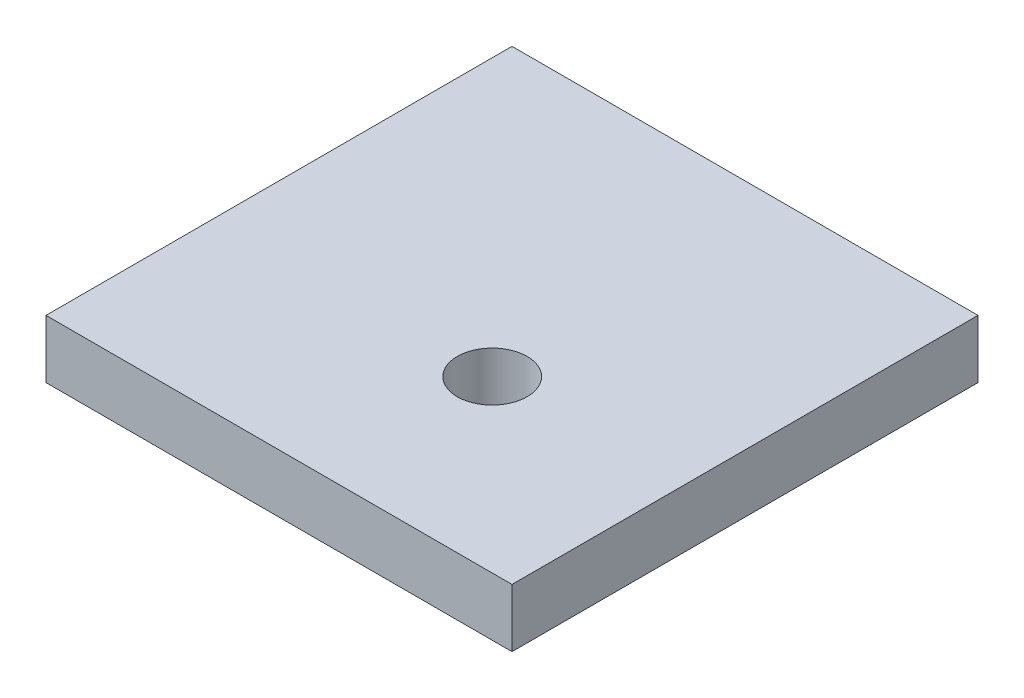
ISO-10303-21;
HEADER;
FILE_DESCRIPTION(('STEP AP214'),'2;1');
FILE_NAME('part.step','',(''),(''),'','','');
FILE_SCHEMA(('AUTOMOTIVE_DESIGN { 1 0 10303 214 1 1 1 1 }'));
ENDSEC;
DATA;
#1=APPLICATION_CONTEXT('core data for automotive mechanical design processes');
#2=APPLICATION_PROTOCOL_DEFINITION('international standard','automotive_design',2000,#1);
#3=PRODUCT_CONTEXT('',#1,'mechanical');
#4=PRODUCT('Part','Part','',(#3));
#5=PRODUCT_RELATED_PRODUCT_CATEGORY('part','',(#4));
#6=PRODUCT_DEFINITION_FORMATION('','',#4);
#7=PRODUCT_DEFINITION_CONTEXT('part definition',#1,'design');
#8=PRODUCT_DEFINITION('design','',#6,#7);
#9=PRODUCT_DEFINITION_SHAPE('','',#8);
#10=(LENGTH_UNIT() NAMED_UNIT(*) SI_UNIT(.MILLI.,.METRE.));
#11=(NAMED_UNIT(*) PLANE_ANGLE_UNIT() SI_UNIT($,.RADIAN.));
#12=(NAMED_UNIT(*) SI_UNIT($,.STERADIAN.) SOLID_ANGLE_UNIT());
#13=UNCERTAINTY_MEASURE_WITH_UNIT(LENGTH_MEASURE(1.E-05),#10,'distance_accuracy_value','');
#14=(GEOMETRIC_REPRESENTATION_CONTEXT(3) GLOBAL_UNCERTAINTY_ASSIGNED_CONTEXT((#13)) GLOBAL_UNIT_ASSIGNED_CONTEXT((#10,
#11,#12)) REPRESENTATION_CONTEXT('',''));
#15=CARTESIAN_POINT('',(0.,0.,0.));
#16=DIRECTION('',(0.,0.,1.));
#17=DIRECTION('',(1.,0.,0.));
#18=AXIS2_PLACEMENT_3D('',#15,#16,#17);
#19=CARTESIAN_POINT('',(200.,-25.,400.));
#20=DIRECTION('',(-1.,0.,0.));
#21=DIRECTION('',(0.,0.,1.));
#22=AXIS2_PLACEMENT_3D('',#19,#20,#21);
#23=PLANE('',#22);
#24=DIRECTION('',(0.,1.,0.));
#25=VECTOR('',#24,1.);
#26=CARTESIAN_POINT('',(200.,-25.,0.));
#27=LINE('',#26,#25);
#28=CARTESIAN_POINT('',(200.,-25.,0.));
#29=VERTEX_POINT('',#28);
#30=CARTESIAN_POINT('',(200.,25.,0.));
#31=VERTEX_POINT('',#30);
#32=EDGE_CURVE('E106',#29,#31,#27,.T.);
#33=ORIENTED_EDGE('',*,*,#32,.T.);
#34=DIRECTION('',(0.,0.,-1.));
#35=VECTOR('',#34,1.);
#36=CARTESIAN_POINT('',(200.,25.,400.));
#37=LINE('',#36,#35);
#38=CARTESIAN_POINT('',(200.,25.,400.));
#39=VERTEX_POINT('',#38);
#40=EDGE_CURVE('E11',#39,#31,#37,.T.);
#41=ORIENTED_EDGE('',*,*,#40,.F.);
#42=DIRECTION('',(0.,1.,0.));
#43=VECTOR('',#42,1.);
#44=CARTESIAN_POINT('',(200.,-25.,400.));
#45=LINE('',#44,#43);
#46=CARTESIAN_POINT('',(200.,-25.,400.));
#47=VERTEX_POINT('',#46);
#48=EDGE_CURVE('E90',#47,#39,#45,.T.);
#49=ORIENTED_EDGE('',*,*,#48,.F.);
#50=DIRECTION('',(0.,0.,-1.));
#51=VECTOR('',#50,1.);
#52=CARTESIAN_POINT('',(200.,-25.,400.));
#53=LINE('',#52,#51);
#54=EDGE_CURVE('E102',#47,#29,#53,.T.);
#55=ORIENTED_EDGE('',*,*,#54,.T.);
#56=EDGE_LOOP('',(#33,#41,#49,#55));
#57=FACE_BOUND('',#56,.T.);
#58=ADVANCED_FACE('F38',(#57),#23,.F.);
#59=CARTESIAN_POINT('',(-200.,25.,400.));
#60=DIRECTION('',(0.,-1.,0.));
#61=DIRECTION('',(0.,0.,-1.));
#62=AXIS2_PLACEMENT_3D('',#59,#60,#61);
#63=PLANE('',#62);
#64=CARTESIAN_POINT('',(37.,25.,254.));
#65=DIRECTION('',(0.,1.,0.));
#66=DIRECTION('',(0.,0.,1.));
#67=AXIS2_PLACEMENT_3D('',#64,#65,#66);
#68=CIRCLE('',#67,30.);
#69=CARTESIAN_POINT('',(37.,25.,284.));
#70=VERTEX_POINT('',#69);
#71=EDGE_CURVE('E127',#70,#70,#68,.T.);
#72=ORIENTED_EDGE('',*,*,#71,.F.);
#73=EDGE_LOOP('',(#72));
#74=FACE_BOUND('',#73,.T.);
#75=DIRECTION('',(-1.,0.,0.));
#76=VECTOR('',#75,1.);
#77=CARTESIAN_POINT('',(-200.,25.,0.));
#78=LINE('',#77,#76);
#79=CARTESIAN_POINT('',(-200.,25.,0.));
#80=VERTEX_POINT('',#79);
#81=EDGE_CURVE('E95',#31,#80,#78,.T.);
#82=ORIENTED_EDGE('',*,*,#81,.T.);
#83=DIRECTION('',(0.,0.,-1.));
#84=VECTOR('',#83,1.);
#85=CARTESIAN_POINT('',(-200.,25.,400.));
#86=LINE('',#85,#84);
#87=CARTESIAN_POINT('',(-200.,25.,400.));
#88=VERTEX_POINT('',#87);
#89=EDGE_CURVE('E47',#88,#80,#86,.T.);
#90=ORIENTED_EDGE('',*,*,#89,.F.);
#91=DIRECTION('',(-1.,0.,0.));
#92=VECTOR('',#91,1.);
#93=CARTESIAN_POINT('',(-200.,25.,400.));
#94=LINE('',#93,#92);
#95=EDGE_CURVE('E85',#39,#88,#94,.T.);
#96=ORIENTED_EDGE('',*,*,#95,.F.);
#97=ORIENTED_EDGE('',*,*,#40,.T.);
#98=EDGE_LOOP('',(#82,#90,#96,#97));
#99=FACE_BOUND('',#98,.T.);
#100=ADVANCED_FACE('F94',(#74,#99),#63,.F.);
#101=CARTESIAN_POINT('',(-200.,-25.,400.));
#102=DIRECTION('',(1.,0.,0.));
#103=DIRECTION('',(0.,0.,-1.));
#104=AXIS2_PLACEMENT_3D('',#101,#102,#103);
#105=PLANE('',#104);
#106=DIRECTION('',(0.,-1.,0.));
#107=VECTOR('',#106,1.);
#108=CARTESIAN_POINT('',(-200.,-25.,0.));
#109=LINE('',#108,#107);
#110=CARTESIAN_POINT('',(-200.,-25.,0.));
#111=VERTEX_POINT('',#110);
#112=EDGE_CURVE('E72',#80,#111,#109,.T.);
#113=ORIENTED_EDGE('',*,*,#112,.T.);
#114=DIRECTION('',(0.,0.,-1.));
#115=VECTOR('',#114,1.);
#116=CARTESIAN_POINT('',(-200.,-25.,400.));
#117=LINE('',#116,#115);
#118=CARTESIAN_POINT('',(-200.,-25.,400.));
#119=VERTEX_POINT('',#118);
#120=EDGE_CURVE('E97',#119,#111,#117,.T.);
#121=ORIENTED_EDGE('',*,*,#120,.F.);
#122=DIRECTION('',(0.,-1.,0.));
#123=VECTOR('',#122,1.);
#124=CARTESIAN_POINT('',(-200.,-25.,400.));
#125=LINE('',#124,#123);
#126=EDGE_CURVE('E88',#88,#119,#125,.T.);
#127=ORIENTED_EDGE('',*,*,#126,.F.);
#128=ORIENTED_EDGE('',*,*,#89,.T.);
#129=EDGE_LOOP('',(#113,#121,#127,#128));
#130=FACE_BOUND('',#129,.T.);
#131=ADVANCED_FACE('F98',(#130),#105,.F.);
#132=CARTESIAN_POINT('',(-200.,-25.,400.));
#133=DIRECTION('',(0.,1.,0.));
#134=DIRECTION('',(0.,0.,1.));
#135=AXIS2_PLACEMENT_3D('',#132,#133,#134);
#136=PLANE('',#135);
#137=CARTESIAN_POINT('',(37.,-25.,254.));
#138=DIRECTION('',(0.,1.,0.));
#139=DIRECTION('',(0.,0.,1.));
#140=AXIS2_PLACEMENT_3D('',#137,#138,#139);
#141=CIRCLE('',#140,30.);
#142=CARTESIAN_POINT('',(37.,-25.,284.));
#143=VERTEX_POINT('',#142);
#144=EDGE_CURVE('E110',#143,#143,#141,.T.);
#145=ORIENTED_EDGE('',*,*,#144,.T.);
#146=EDGE_LOOP('',(#145));
#147=FACE_BOUND('',#146,.T.);
#148=DIRECTION('',(1.,0.,0.));
#149=VECTOR('',#148,1.);
#150=CARTESIAN_POINT('',(-200.,-25.,0.));
#151=LINE('',#150,#149);
#152=EDGE_CURVE('E78',#111,#29,#151,.T.);
#153=ORIENTED_EDGE('',*,*,#152,.T.);
#154=ORIENTED_EDGE('',*,*,#54,.F.);
#155=DIRECTION('',(1.,0.,0.));
#156=VECTOR('',#155,1.);
#157=CARTESIAN_POINT('',(-200.,-25.,400.));
#158=LINE('',#157,#156);
#159=EDGE_CURVE('E55',#119,#47,#158,.T.);
#160=ORIENTED_EDGE('',*,*,#159,.F.);
#161=ORIENTED_EDGE('',*,*,#120,.T.);
#162=EDGE_LOOP('',(#153,#154,#160,#161));
#163=FACE_BOUND('',#162,.T.);
#164=ADVANCED_FACE('F120',(#147,#163),#136,.F.);
#165=CARTESIAN_POINT('',(0.,0.,400.));
#166=DIRECTION('',(0.,0.,-1.));
#167=DIRECTION('',(-1.,0.,0.));
#168=AXIS2_PLACEMENT_3D('',#165,#166,#167);
#169=PLANE('',#168);
#170=ORIENTED_EDGE('',*,*,#48,.T.);
#171=ORIENTED_EDGE('',*,*,#95,.T.);
#172=ORIENTED_EDGE('',*,*,#126,.T.);
#173=ORIENTED_EDGE('',*,*,#159,.T.);
#174=EDGE_LOOP('',(#170,#171,#172,#173));
#175=FACE_BOUND('',#174,.T.);
#176=ADVANCED_FACE('F86',(#175),#169,.F.);
#177=CARTESIAN_POINT('',(0.,0.,0.));
#178=DIRECTION('',(0.,0.,-1.));
#179=DIRECTION('',(-1.,0.,0.));
#180=AXIS2_PLACEMENT_3D('',#177,#178,#179);
#181=PLANE('',#180);
#182=ORIENTED_EDGE('',*,*,#32,.F.);
#183=ORIENTED_EDGE('',*,*,#152,.F.);
#184=ORIENTED_EDGE('',*,*,#112,.F.);
#185=ORIENTED_EDGE('',*,*,#81,.F.);
#186=EDGE_LOOP('',(#182,#183,#184,#185));
#187=FACE_BOUND('',#186,.T.);
#188=ADVANCED_FACE('F123',(#187),#181,.T.);
#189=CARTESIAN_POINT('',(37.,-25.,254.));
#190=DIRECTION('',(0.,1.,0.));
#191=DIRECTION('',(0.,0.,1.));
#192=AXIS2_PLACEMENT_3D('',#189,#190,#191);
#193=CYLINDRICAL_SURFACE('',#192,30.);
#194=ORIENTED_EDGE('',*,*,#144,.F.);
#195=EDGE_LOOP('',(#194));
#196=FACE_BOUND('',#195,.T.);
#197=ORIENTED_EDGE('',*,*,#71,.T.);
#198=EDGE_LOOP('',(#197));
#199=FACE_BOUND('',#198,.T.);
#200=ADVANCED_FACE('F136',(#196,#199),#193,.F.);
#201=CLOSED_SHELL('',(#58,#100,#131,#164,#176,#188,#200));
#202=MANIFOLD_SOLID_BREP('B2',#201);
#203=ADVANCED_BREP_SHAPE_REPRESENTATION('',(#18,#202),#14);
#204=SHAPE_DEFINITION_REPRESENTATION(#9,#203);
ENDSEC;
END-ISO-10303-21;
